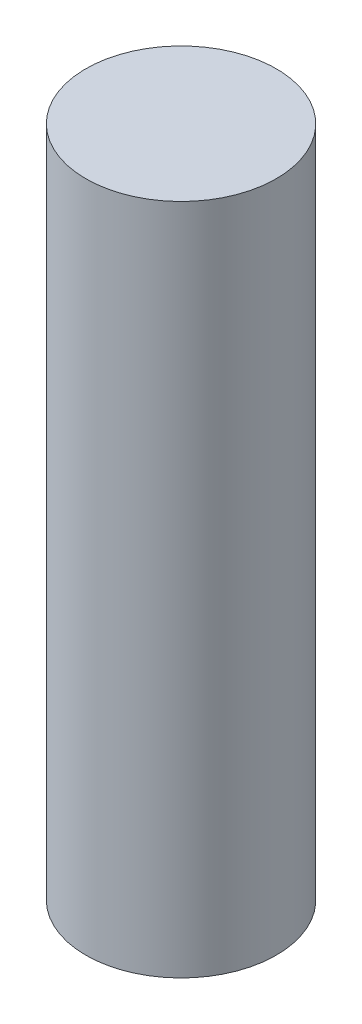
ISO-10303-21;
HEADER;
FILE_DESCRIPTION(('STEP AP214'),'2;1');
FILE_NAME('part.step','',(''),(''),'','','');
FILE_SCHEMA(('AUTOMOTIVE_DESIGN { 1 0 10303 214 1 1 1 1 }'));
ENDSEC;
DATA;
#1=APPLICATION_CONTEXT('core data for automotive mechanical design processes');
#2=APPLICATION_PROTOCOL_DEFINITION('international standard','automotive_design',2000,#1);
#3=PRODUCT_CONTEXT('',#1,'mechanical');
#4=PRODUCT('Part','Part','',(#3));
#5=PRODUCT_RELATED_PRODUCT_CATEGORY('part','',(#4));
#6=PRODUCT_DEFINITION_FORMATION('','',#4);
#7=PRODUCT_DEFINITION_CONTEXT('part definition',#1,'design');
#8=PRODUCT_DEFINITION('design','',#6,#7);
#9=PRODUCT_DEFINITION_SHAPE('','',#8);
#10=(LENGTH_UNIT() NAMED_UNIT(*) SI_UNIT(.MILLI.,.METRE.));
#11=(NAMED_UNIT(*) PLANE_ANGLE_UNIT() SI_UNIT($,.RADIAN.));
#12=(NAMED_UNIT(*) SI_UNIT($,.STERADIAN.) SOLID_ANGLE_UNIT());
#13=UNCERTAINTY_MEASURE_WITH_UNIT(LENGTH_MEASURE(1.E-05),#10,'distance_accuracy_value','');
#14=(GEOMETRIC_REPRESENTATION_CONTEXT(3) GLOBAL_UNCERTAINTY_ASSIGNED_CONTEXT((#13)) GLOBAL_UNIT_ASSIGNED_CONTEXT((#10,
#11,#12)) REPRESENTATION_CONTEXT('',''));
#15=CARTESIAN_POINT('',(0.,0.,0.));
#16=DIRECTION('',(0.,0.,1.));
#17=DIRECTION('',(1.,0.,0.));
#18=AXIS2_PLACEMENT_3D('',#15,#16,#17);
#19=CARTESIAN_POINT('',(0.,60.,0.));
#20=DIRECTION('',(0.,-1.,0.));
#21=DIRECTION('',(0.,0.,-1.));
#22=AXIS2_PLACEMENT_3D('',#19,#20,#21);
#23=CYLINDRICAL_SURFACE('',#22,8.5);
#24=CARTESIAN_POINT('',(0.,60.,0.));
#25=DIRECTION('',(0.,1.,0.));
#26=DIRECTION('',(0.,0.,1.));
#27=AXIS2_PLACEMENT_3D('',#24,#25,#26);
#28=CIRCLE('',#27,8.5);
#29=CARTESIAN_POINT('',(0.,60.,8.5));
#30=VERTEX_POINT('',#29);
#31=EDGE_CURVE('E10',#30,#30,#28,.T.);
#32=ORIENTED_EDGE('',*,*,#31,.F.);
#33=EDGE_LOOP('',(#32));
#34=FACE_BOUND('',#33,.T.);
#35=CARTESIAN_POINT('',(0.,0.,0.));
#36=DIRECTION('',(0.,1.,0.));
#37=DIRECTION('',(0.,0.,1.));
#38=AXIS2_PLACEMENT_3D('',#35,#36,#37);
#39=CIRCLE('',#38,8.5);
#40=CARTESIAN_POINT('',(0.,0.,8.5));
#41=VERTEX_POINT('',#40);
#42=EDGE_CURVE('E46',#41,#41,#39,.T.);
#43=ORIENTED_EDGE('',*,*,#42,.T.);
#44=EDGE_LOOP('',(#43));
#45=FACE_BOUND('',#44,.T.);
#46=ADVANCED_FACE('F43',(#34,#45),#23,.T.);
#47=CARTESIAN_POINT('',(0.,60.,0.));
#48=DIRECTION('',(0.,1.,0.));
#49=DIRECTION('',(0.,0.,1.));
#50=AXIS2_PLACEMENT_3D('',#47,#48,#49);
#51=PLANE('',#50);
#52=ORIENTED_EDGE('',*,*,#31,.T.);
#53=EDGE_LOOP('',(#52));
#54=FACE_BOUND('',#53,.T.);
#55=ADVANCED_FACE('F60',(#54),#51,.T.);
#56=CARTESIAN_POINT('',(0.,0.,0.));
#57=DIRECTION('',(0.,1.,0.));
#58=DIRECTION('',(0.,0.,1.));
#59=AXIS2_PLACEMENT_3D('',#56,#57,#58);
#60=PLANE('',#59);
#61=ORIENTED_EDGE('',*,*,#42,.F.);
#62=EDGE_LOOP('',(#61));
#63=FACE_BOUND('',#62,.T.);
#64=ADVANCED_FACE('F58',(#63),#60,.F.);
#65=CLOSED_SHELL('',(#46,#55,#64));
#66=MANIFOLD_SOLID_BREP('B2',#65);
#67=ADVANCED_BREP_SHAPE_REPRESENTATION('',(#18,#66),#14);
#68=SHAPE_DEFINITION_REPRESENTATION(#9,#67);
ENDSEC;
END-ISO-10303-21;
